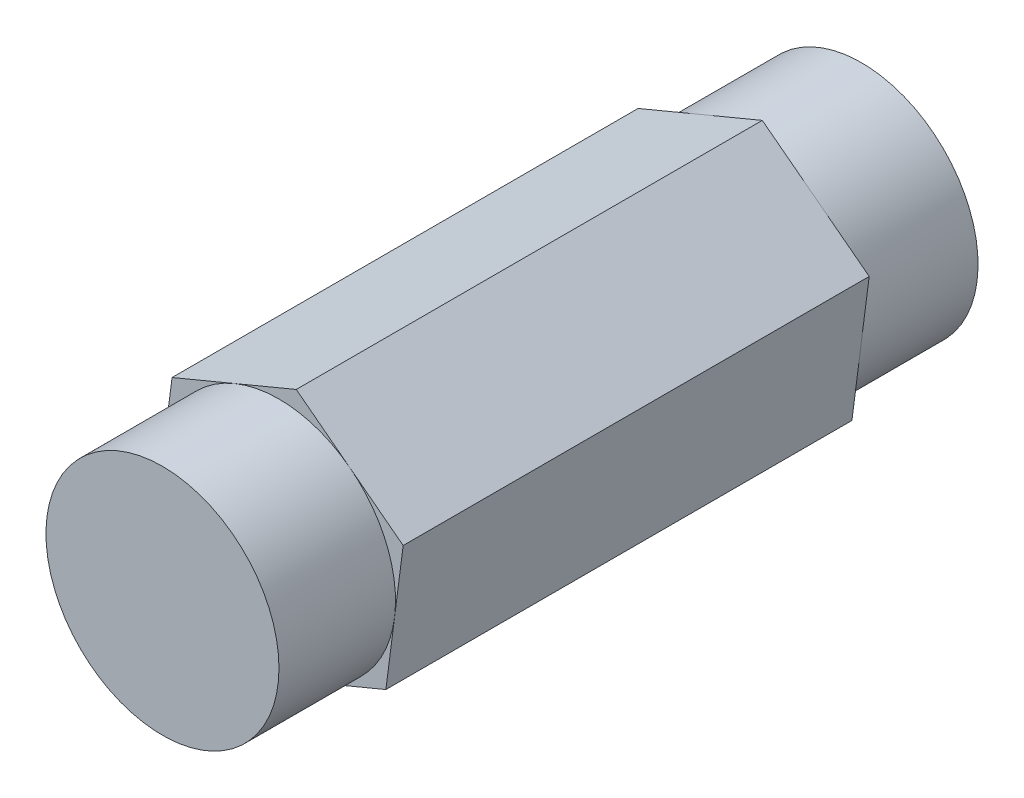
ISO-10303-21;
HEADER;
FILE_DESCRIPTION(('STEP AP214'),'2;1');
FILE_NAME('part.step','',(''),(''),'','','');
FILE_SCHEMA(('AUTOMOTIVE_DESIGN { 1 0 10303 214 1 1 1 1 }'));
ENDSEC;
DATA;
#1=APPLICATION_CONTEXT('core data for automotive mechanical design processes');
#2=APPLICATION_PROTOCOL_DEFINITION('international standard','automotive_design',2000,#1);
#3=PRODUCT_CONTEXT('',#1,'mechanical');
#4=PRODUCT('Part','Part','',(#3));
#5=PRODUCT_RELATED_PRODUCT_CATEGORY('part','',(#4));
#6=PRODUCT_DEFINITION_FORMATION('','',#4);
#7=PRODUCT_DEFINITION_CONTEXT('part definition',#1,'design');
#8=PRODUCT_DEFINITION('design','',#6,#7);
#9=PRODUCT_DEFINITION_SHAPE('','',#8);
#10=(LENGTH_UNIT() NAMED_UNIT(*) SI_UNIT(.MILLI.,.METRE.));
#11=(NAMED_UNIT(*) PLANE_ANGLE_UNIT() SI_UNIT($,.RADIAN.));
#12=(NAMED_UNIT(*) SI_UNIT($,.STERADIAN.) SOLID_ANGLE_UNIT());
#13=UNCERTAINTY_MEASURE_WITH_UNIT(LENGTH_MEASURE(1.E-05),#10,'distance_accuracy_value','');
#14=(GEOMETRIC_REPRESENTATION_CONTEXT(3) GLOBAL_UNCERTAINTY_ASSIGNED_CONTEXT((#13)) GLOBAL_UNIT_ASSIGNED_CONTEXT((#10,
#11,#12)) REPRESENTATION_CONTEXT('',''));
#15=CARTESIAN_POINT('',(0.,0.,0.));
#16=DIRECTION('',(0.,0.,1.));
#17=DIRECTION('',(1.,0.,0.));
#18=AXIS2_PLACEMENT_3D('',#15,#16,#17);
#19=CARTESIAN_POINT('',(0.,0.,20.));
#20=DIRECTION('',(0.,0.,1.));
#21=DIRECTION('',(1.,0.,0.));
#22=AXIS2_PLACEMENT_3D('',#19,#20,#21);
#23=PLANE('',#22);
#24=CARTESIAN_POINT('',(0.,0.,20.));
#25=DIRECTION('',(0.,0.,1.));
#26=DIRECTION('',(1.,0.,0.));
#27=AXIS2_PLACEMENT_3D('',#24,#25,#26);
#28=CIRCLE('',#27,4.99999999999999);
#29=CARTESIAN_POINT('',(3.03550186362045,3.97312577650854,20.));
#30=VERTEX_POINT('',#29);
#31=CARTESIAN_POINT('',(-1.92307692307694,4.61538461538459,20.));
#32=VERTEX_POINT('',#31);
#33=EDGE_CURVE('E46',#30,#32,#28,.T.);
#34=ORIENTED_EDGE('',*,*,#33,.F.);
#35=DIRECTION('',(-0.794625155301711,0.607100372724092,0.));
#36=VECTOR('',#35,1.);
#37=CARTESIAN_POINT('',(5.3293871002119,2.22057795842166,20.));
#38=LINE('',#37,#36);
#39=CARTESIAN_POINT('',(0.741616627029006,5.72567359459542,20.));
#40=VERTEX_POINT('',#39);
#41=EDGE_CURVE('E139',#30,#40,#38,.T.);
#42=ORIENTED_EDGE('',*,*,#41,.T.);
#43=DIRECTION('',(-0.923076923076921,-0.384615384615389,0.));
#44=VECTOR('',#43,1.);
#45=CARTESIAN_POINT('',(0.741616627029006,5.72567359459542,20.));
#46=LINE('',#45,#44);
#47=EDGE_CURVE('E152',#40,#32,#46,.T.);
#48=ORIENTED_EDGE('',*,*,#47,.T.);
#49=EDGE_LOOP('',(#34,#42,#48));
#50=FACE_BOUND('',#49,.T.);
#51=ADVANCED_FACE('F35',(#50),#23,.T.);
#52=CARTESIAN_POINT('',(-4.95857878669739,0.642258838876046,20.));
#53=VERTEX_POINT('',#52);
#54=EDGE_CURVE('E11',#32,#53,#28,.T.);
#55=ORIENTED_EDGE('',*,*,#54,.F.);
#56=CARTESIAN_POINT('',(-4.58777047318289,3.50509563617377,20.));
#57=VERTEX_POINT('',#56);
#58=EDGE_CURVE('E138',#32,#57,#46,.T.);
#59=ORIENTED_EDGE('',*,*,#58,.T.);
#60=DIRECTION('',(-0.12845176777521,-0.991715757339482,0.));
#61=VECTOR('',#60,1.);
#62=CARTESIAN_POINT('',(-4.58777047318289,3.50509563617377,20.));
#63=LINE('',#62,#61);
#64=EDGE_CURVE('E172',#57,#53,#63,.T.);
#65=ORIENTED_EDGE('',*,*,#64,.T.);
#66=EDGE_LOOP('',(#55,#59,#65));
#67=FACE_BOUND('',#66,.T.);
#68=ADVANCED_FACE('F254',(#67),#23,.T.);
#69=CARTESIAN_POINT('',(-3.03550186362045,-3.97312577650854,20.));
#70=VERTEX_POINT('',#69);
#71=EDGE_CURVE('E44',#53,#70,#28,.T.);
#72=ORIENTED_EDGE('',*,*,#71,.F.);
#73=CARTESIAN_POINT('',(-5.32938710021189,-2.22057795842167,20.));
#74=VERTEX_POINT('',#73);
#75=EDGE_CURVE('E171',#53,#74,#63,.T.);
#76=ORIENTED_EDGE('',*,*,#75,.T.);
#77=DIRECTION('',(0.794625155301711,-0.607100372724093,0.));
#78=VECTOR('',#77,1.);
#79=CARTESIAN_POINT('',(-5.32938710021189,-2.22057795842167,20.));
#80=LINE('',#79,#78);
#81=EDGE_CURVE('E176',#74,#70,#80,.T.);
#82=ORIENTED_EDGE('',*,*,#81,.T.);
#83=EDGE_LOOP('',(#72,#76,#82));
#84=FACE_BOUND('',#83,.T.);
#85=ADVANCED_FACE('F257',(#84),#23,.T.);
#86=CARTESIAN_POINT('',(1.92307692307695,-4.6153846153846,20.));
#87=VERTEX_POINT('',#86);
#88=EDGE_CURVE('E61',#70,#87,#28,.T.);
#89=ORIENTED_EDGE('',*,*,#88,.F.);
#90=CARTESIAN_POINT('',(-0.741616627028999,-5.72567359459543,20.));
#91=VERTEX_POINT('',#90);
#92=EDGE_CURVE('E175',#70,#91,#80,.T.);
#93=ORIENTED_EDGE('',*,*,#92,.T.);
#94=DIRECTION('',(0.923076923076921,0.38461538461539,0.));
#95=VECTOR('',#94,1.);
#96=CARTESIAN_POINT('',(-0.741616627028999,-5.72567359459543,20.));
#97=LINE('',#96,#95);
#98=EDGE_CURVE('E180',#91,#87,#97,.T.);
#99=ORIENTED_EDGE('',*,*,#98,.T.);
#100=EDGE_LOOP('',(#89,#93,#99));
#101=FACE_BOUND('',#100,.T.);
#102=ADVANCED_FACE('F259',(#101),#23,.T.);
#103=CARTESIAN_POINT('',(4.9585787866974,-0.642258838876049,20.));
#104=VERTEX_POINT('',#103);
#105=EDGE_CURVE('E53',#87,#104,#28,.T.);
#106=ORIENTED_EDGE('',*,*,#105,.F.);
#107=CARTESIAN_POINT('',(4.5877704731829,-3.50509563617377,20.));
#108=VERTEX_POINT('',#107);
#109=EDGE_CURVE('E179',#87,#108,#97,.T.);
#110=ORIENTED_EDGE('',*,*,#109,.T.);
#111=DIRECTION('',(0.12845176777521,0.991715757339482,0.));
#112=VECTOR('',#111,1.);
#113=CARTESIAN_POINT('',(4.5877704731829,-3.50509563617377,20.));
#114=LINE('',#113,#112);
#115=EDGE_CURVE('E150',#108,#104,#114,.T.);
#116=ORIENTED_EDGE('',*,*,#115,.T.);
#117=EDGE_LOOP('',(#106,#110,#116));
#118=FACE_BOUND('',#117,.T.);
#119=ADVANCED_FACE('F265',(#118),#23,.T.);
#120=CARTESIAN_POINT('',(0.,0.,0.));
#121=DIRECTION('',(0.,0.,1.));
#122=DIRECTION('',(1.,0.,0.));
#123=AXIS2_PLACEMENT_3D('',#120,#121,#122);
#124=PLANE('',#123);
#125=CARTESIAN_POINT('',(0.,0.,0.));
#126=DIRECTION('',(0.,0.,-1.));
#127=DIRECTION('',(-1.,0.,0.));
#128=AXIS2_PLACEMENT_3D('',#125,#126,#127);
#129=CIRCLE('',#128,4.99999999999998);
#130=CARTESIAN_POINT('',(-4.9585787866974,0.642258838876047,0.));
#131=VERTEX_POINT('',#130);
#132=CARTESIAN_POINT('',(-1.92307692307694,4.61538461538459,0.));
#133=VERTEX_POINT('',#132);
#134=EDGE_CURVE('E160',#131,#133,#129,.T.);
#135=ORIENTED_EDGE('',*,*,#134,.F.);
#136=DIRECTION('',(-0.12845176777521,-0.991715757339482,0.));
#137=VECTOR('',#136,1.);
#138=CARTESIAN_POINT('',(-4.58777047318289,3.50509563617377,0.));
#139=LINE('',#138,#137);
#140=CARTESIAN_POINT('',(-4.58777047318289,3.50509563617377,0.));
#141=VERTEX_POINT('',#140);
#142=EDGE_CURVE('E194',#141,#131,#139,.T.);
#143=ORIENTED_EDGE('',*,*,#142,.F.);
#144=DIRECTION('',(-0.923076923076921,-0.384615384615389,0.));
#145=VECTOR('',#144,1.);
#146=CARTESIAN_POINT('',(0.741616627029006,5.72567359459542,0.));
#147=LINE('',#146,#145);
#148=EDGE_CURVE('E189',#133,#141,#147,.T.);
#149=ORIENTED_EDGE('',*,*,#148,.F.);
#150=EDGE_LOOP('',(#135,#143,#149));
#151=FACE_BOUND('',#150,.T.);
#152=ADVANCED_FACE('F237',(#151),#124,.F.);
#153=CARTESIAN_POINT('',(3.03550186362045,3.97312577650854,0.));
#154=VERTEX_POINT('',#153);
#155=EDGE_CURVE('E156',#133,#154,#129,.T.);
#156=ORIENTED_EDGE('',*,*,#155,.F.);
#157=CARTESIAN_POINT('',(0.741616627029006,5.72567359459542,0.));
#158=VERTEX_POINT('',#157);
#159=EDGE_CURVE('E190',#158,#133,#147,.T.);
#160=ORIENTED_EDGE('',*,*,#159,.F.);
#161=DIRECTION('',(-0.794625155301711,0.607100372724092,0.));
#162=VECTOR('',#161,1.);
#163=CARTESIAN_POINT('',(5.3293871002119,2.22057795842166,0.));
#164=LINE('',#163,#162);
#165=EDGE_CURVE('E186',#154,#158,#164,.T.);
#166=ORIENTED_EDGE('',*,*,#165,.F.);
#167=EDGE_LOOP('',(#156,#160,#166));
#168=FACE_BOUND('',#167,.T.);
#169=ADVANCED_FACE('F230',(#168),#124,.F.);
#170=CARTESIAN_POINT('',(4.9585787866974,-0.642258838876049,0.));
#171=VERTEX_POINT('',#170);
#172=EDGE_CURVE('E158',#154,#171,#129,.T.);
#173=ORIENTED_EDGE('',*,*,#172,.F.);
#174=CARTESIAN_POINT('',(5.3293871002119,2.22057795842166,0.));
#175=VERTEX_POINT('',#174);
#176=EDGE_CURVE('E187',#175,#154,#164,.T.);
#177=ORIENTED_EDGE('',*,*,#176,.F.);
#178=DIRECTION('',(0.12845176777521,0.991715757339482,0.));
#179=VECTOR('',#178,1.);
#180=CARTESIAN_POINT('',(4.5877704731829,-3.50509563617377,0.));
#181=LINE('',#180,#179);
#182=EDGE_CURVE('E165',#171,#175,#181,.T.);
#183=ORIENTED_EDGE('',*,*,#182,.F.);
#184=EDGE_LOOP('',(#173,#177,#183));
#185=FACE_BOUND('',#184,.T.);
#186=ADVANCED_FACE('F228',(#185),#124,.F.);
#187=CARTESIAN_POINT('',(1.92307692307695,-4.6153846153846,0.));
#188=VERTEX_POINT('',#187);
#189=EDGE_CURVE('E220',#171,#188,#129,.T.);
#190=ORIENTED_EDGE('',*,*,#189,.F.);
#191=CARTESIAN_POINT('',(4.5877704731829,-3.50509563617377,0.));
#192=VERTEX_POINT('',#191);
#193=EDGE_CURVE('E183',#192,#171,#181,.T.);
#194=ORIENTED_EDGE('',*,*,#193,.F.);
#195=DIRECTION('',(0.923076923076921,0.38461538461539,0.));
#196=VECTOR('',#195,1.);
#197=CARTESIAN_POINT('',(-0.741616627028999,-5.72567359459543,0.));
#198=LINE('',#197,#196);
#199=EDGE_CURVE('E200',#188,#192,#198,.T.);
#200=ORIENTED_EDGE('',*,*,#199,.F.);
#201=EDGE_LOOP('',(#190,#194,#200));
#202=FACE_BOUND('',#201,.T.);
#203=ADVANCED_FACE('F301',(#202),#124,.F.);
#204=CARTESIAN_POINT('',(-3.03550186362045,-3.97312577650854,0.));
#205=VERTEX_POINT('',#204);
#206=EDGE_CURVE('E217',#188,#205,#129,.T.);
#207=ORIENTED_EDGE('',*,*,#206,.F.);
#208=CARTESIAN_POINT('',(-0.741616627028999,-5.72567359459543,0.));
#209=VERTEX_POINT('',#208);
#210=EDGE_CURVE('E201',#209,#188,#198,.T.);
#211=ORIENTED_EDGE('',*,*,#210,.F.);
#212=DIRECTION('',(0.794625155301711,-0.607100372724093,0.));
#213=VECTOR('',#212,1.);
#214=CARTESIAN_POINT('',(-5.32938710021189,-2.22057795842167,0.));
#215=LINE('',#214,#213);
#216=EDGE_CURVE('E196',#205,#209,#215,.T.);
#217=ORIENTED_EDGE('',*,*,#216,.F.);
#218=EDGE_LOOP('',(#207,#211,#217));
#219=FACE_BOUND('',#218,.T.);
#220=ADVANCED_FACE('F277',(#219),#124,.F.);
#221=CARTESIAN_POINT('',(4.5877704731829,-3.50509563617377,20.));
#222=DIRECTION('',(-0.991715757339483,0.12845176777521,0.));
#223=DIRECTION('',(-0.12845176777521,-0.991715757339483,0.));
#224=AXIS2_PLACEMENT_3D('',#221,#222,#223);
#225=PLANE('',#224);
#226=ORIENTED_EDGE('',*,*,#193,.T.);
#227=ORIENTED_EDGE('',*,*,#182,.T.);
#228=DIRECTION('',(0.,0.,-1.));
#229=VECTOR('',#228,1.);
#230=CARTESIAN_POINT('',(5.3293871002119,2.22057795842166,20.));
#231=LINE('',#230,#229);
#232=CARTESIAN_POINT('',(5.3293871002119,2.22057795842166,20.));
#233=VERTEX_POINT('',#232);
#234=EDGE_CURVE('E39',#233,#175,#231,.T.);
#235=ORIENTED_EDGE('',*,*,#234,.F.);
#236=EDGE_CURVE('E134',#104,#233,#114,.T.);
#237=ORIENTED_EDGE('',*,*,#236,.F.);
#238=ORIENTED_EDGE('',*,*,#115,.F.);
#239=DIRECTION('',(0.,0.,-1.));
#240=VECTOR('',#239,1.);
#241=CARTESIAN_POINT('',(4.5877704731829,-3.50509563617377,20.));
#242=LINE('',#241,#240);
#243=EDGE_CURVE('E182',#108,#192,#242,.T.);
#244=ORIENTED_EDGE('',*,*,#243,.T.);
#245=EDGE_LOOP('',(#226,#227,#235,#237,#238,#244));
#246=FACE_BOUND('',#245,.T.);
#247=ADVANCED_FACE('F37',(#246),#225,.F.);
#248=CARTESIAN_POINT('',(5.3293871002119,2.22057795842166,20.));
#249=DIRECTION('',(-0.607100372724092,-0.794625155301711,0.));
#250=DIRECTION('',(0.794625155301711,-0.607100372724092,0.));
#251=AXIS2_PLACEMENT_3D('',#248,#249,#250);
#252=PLANE('',#251);
#253=ORIENTED_EDGE('',*,*,#176,.T.);
#254=ORIENTED_EDGE('',*,*,#165,.T.);
#255=DIRECTION('',(0.,0.,-1.));
#256=VECTOR('',#255,1.);
#257=CARTESIAN_POINT('',(0.741616627029006,5.72567359459542,20.));
#258=LINE('',#257,#256);
#259=EDGE_CURVE('E146',#40,#158,#258,.T.);
#260=ORIENTED_EDGE('',*,*,#259,.F.);
#261=ORIENTED_EDGE('',*,*,#41,.F.);
#262=EDGE_CURVE('E128',#233,#30,#38,.T.);
#263=ORIENTED_EDGE('',*,*,#262,.F.);
#264=ORIENTED_EDGE('',*,*,#234,.T.);
#265=EDGE_LOOP('',(#253,#254,#260,#261,#263,#264));
#266=FACE_BOUND('',#265,.T.);
#267=ADVANCED_FACE('F144',(#266),#252,.F.);
#268=CARTESIAN_POINT('',(0.741616627029006,5.72567359459542,20.));
#269=DIRECTION('',(0.384615384615389,-0.923076923076921,0.));
#270=DIRECTION('',(0.923076923076921,0.384615384615389,0.));
#271=AXIS2_PLACEMENT_3D('',#268,#269,#270);
#272=PLANE('',#271);
#273=ORIENTED_EDGE('',*,*,#159,.T.);
#274=ORIENTED_EDGE('',*,*,#148,.T.);
#275=DIRECTION('',(0.,0.,-1.));
#276=VECTOR('',#275,1.);
#277=CARTESIAN_POINT('',(-4.58777047318289,3.50509563617377,20.));
#278=LINE('',#277,#276);
#279=EDGE_CURVE('E212',#57,#141,#278,.T.);
#280=ORIENTED_EDGE('',*,*,#279,.F.);
#281=ORIENTED_EDGE('',*,*,#58,.F.);
#282=ORIENTED_EDGE('',*,*,#47,.F.);
#283=ORIENTED_EDGE('',*,*,#259,.T.);
#284=EDGE_LOOP('',(#273,#274,#280,#281,#282,#283));
#285=FACE_BOUND('',#284,.T.);
#286=ADVANCED_FACE('F232',(#285),#272,.F.);
#287=CARTESIAN_POINT('',(-4.58777047318289,3.50509563617377,20.));
#288=DIRECTION('',(0.991715757339483,-0.12845176777521,0.));
#289=DIRECTION('',(0.12845176777521,0.991715757339483,0.));
#290=AXIS2_PLACEMENT_3D('',#287,#288,#289);
#291=PLANE('',#290);
#292=ORIENTED_EDGE('',*,*,#142,.T.);
#293=CARTESIAN_POINT('',(-5.32938710021189,-2.22057795842167,0.));
#294=VERTEX_POINT('',#293);
#295=EDGE_CURVE('E193',#131,#294,#139,.T.);
#296=ORIENTED_EDGE('',*,*,#295,.T.);
#297=DIRECTION('',(0.,0.,-1.));
#298=VECTOR('',#297,1.);
#299=CARTESIAN_POINT('',(-5.32938710021189,-2.22057795842167,20.));
#300=LINE('',#299,#298);
#301=EDGE_CURVE('E209',#74,#294,#300,.T.);
#302=ORIENTED_EDGE('',*,*,#301,.F.);
#303=ORIENTED_EDGE('',*,*,#75,.F.);
#304=ORIENTED_EDGE('',*,*,#64,.F.);
#305=ORIENTED_EDGE('',*,*,#279,.T.);
#306=EDGE_LOOP('',(#292,#296,#302,#303,#304,#305));
#307=FACE_BOUND('',#306,.T.);
#308=ADVANCED_FACE('F240',(#307),#291,.F.);
#309=CARTESIAN_POINT('',(-5.32938710021189,-2.22057795842167,20.));
#310=DIRECTION('',(0.607100372724093,0.794625155301711,0.));
#311=DIRECTION('',(-0.794625155301711,0.607100372724093,0.));
#312=AXIS2_PLACEMENT_3D('',#309,#310,#311);
#313=PLANE('',#312);
#314=EDGE_CURVE('E197',#294,#205,#215,.T.);
#315=ORIENTED_EDGE('',*,*,#314,.T.);
#316=ORIENTED_EDGE('',*,*,#216,.T.);
#317=DIRECTION('',(0.,0.,-1.));
#318=VECTOR('',#317,1.);
#319=CARTESIAN_POINT('',(-0.741616627028999,-5.72567359459543,20.));
#320=LINE('',#319,#318);
#321=EDGE_CURVE('E206',#91,#209,#320,.T.);
#322=ORIENTED_EDGE('',*,*,#321,.F.);
#323=ORIENTED_EDGE('',*,*,#92,.F.);
#324=ORIENTED_EDGE('',*,*,#81,.F.);
#325=ORIENTED_EDGE('',*,*,#301,.T.);
#326=EDGE_LOOP('',(#315,#316,#322,#323,#324,#325));
#327=FACE_BOUND('',#326,.T.);
#328=ADVANCED_FACE('F248',(#327),#313,.F.);
#329=CARTESIAN_POINT('',(-0.741616627028999,-5.72567359459543,20.));
#330=DIRECTION('',(-0.38461538461539,0.923076923076921,0.));
#331=DIRECTION('',(-0.923076923076921,-0.38461538461539,0.));
#332=AXIS2_PLACEMENT_3D('',#329,#330,#331);
#333=PLANE('',#332);
#334=ORIENTED_EDGE('',*,*,#210,.T.);
#335=ORIENTED_EDGE('',*,*,#199,.T.);
#336=ORIENTED_EDGE('',*,*,#243,.F.);
#337=ORIENTED_EDGE('',*,*,#109,.F.);
#338=ORIENTED_EDGE('',*,*,#98,.F.);
#339=ORIENTED_EDGE('',*,*,#321,.T.);
#340=EDGE_LOOP('',(#334,#335,#336,#337,#338,#339));
#341=FACE_BOUND('',#340,.T.);
#342=ADVANCED_FACE('F272',(#341),#333,.F.);
#343=EDGE_CURVE('E132',#104,#30,#28,.T.);
#344=ORIENTED_EDGE('',*,*,#343,.F.);
#345=ORIENTED_EDGE('',*,*,#236,.T.);
#346=ORIENTED_EDGE('',*,*,#262,.T.);
#347=EDGE_LOOP('',(#344,#345,#346));
#348=FACE_BOUND('',#347,.T.);
#349=ADVANCED_FACE('F130',(#348),#23,.T.);
#350=EDGE_CURVE('E168',#205,#131,#129,.T.);
#351=ORIENTED_EDGE('',*,*,#350,.F.);
#352=ORIENTED_EDGE('',*,*,#314,.F.);
#353=ORIENTED_EDGE('',*,*,#295,.F.);
#354=EDGE_LOOP('',(#351,#352,#353));
#355=FACE_BOUND('',#354,.T.);
#356=ADVANCED_FACE('F245',(#355),#124,.F.);
#357=CARTESIAN_POINT('',(0.,0.,-5.));
#358=DIRECTION('',(0.,0.,1.));
#359=DIRECTION('',(1.,0.,0.));
#360=AXIS2_PLACEMENT_3D('',#357,#358,#359);
#361=CYLINDRICAL_SURFACE('',#360,4.99999999999998);
#362=CARTESIAN_POINT('',(0.,0.,-5.));
#363=DIRECTION('',(0.,0.,-1.));
#364=DIRECTION('',(-1.,0.,0.));
#365=AXIS2_PLACEMENT_3D('',#362,#363,#364);
#366=CIRCLE('',#365,4.99999999999998);
#367=CARTESIAN_POINT('',(-4.99999999999998,0.,-5.));
#368=VERTEX_POINT('',#367);
#369=EDGE_CURVE('E163',#368,#368,#366,.T.);
#370=ORIENTED_EDGE('',*,*,#369,.F.);
#371=EDGE_LOOP('',(#370));
#372=FACE_BOUND('',#371,.T.);
#373=ORIENTED_EDGE('',*,*,#134,.T.);
#374=ORIENTED_EDGE('',*,*,#155,.T.);
#375=ORIENTED_EDGE('',*,*,#172,.T.);
#376=ORIENTED_EDGE('',*,*,#189,.T.);
#377=ORIENTED_EDGE('',*,*,#206,.T.);
#378=ORIENTED_EDGE('',*,*,#350,.T.);
#379=EDGE_LOOP('',(#373,#374,#375,#376,#377,#378));
#380=FACE_BOUND('',#379,.T.);
#381=ADVANCED_FACE('F223',(#372,#380),#361,.T.);
#382=CARTESIAN_POINT('',(0.,0.,-5.));
#383=DIRECTION('',(0.,0.,-1.));
#384=DIRECTION('',(-1.,0.,0.));
#385=AXIS2_PLACEMENT_3D('',#382,#383,#384);
#386=PLANE('',#385);
#387=ORIENTED_EDGE('',*,*,#369,.T.);
#388=EDGE_LOOP('',(#387));
#389=FACE_BOUND('',#388,.T.);
#390=ADVANCED_FACE('F334',(#389),#386,.T.);
#391=CARTESIAN_POINT('',(0.,0.,25.));
#392=DIRECTION('',(0.,0.,-1.));
#393=DIRECTION('',(-1.,0.,0.));
#394=AXIS2_PLACEMENT_3D('',#391,#392,#393);
#395=CYLINDRICAL_SURFACE('',#394,4.99999999999999);
#396=CARTESIAN_POINT('',(0.,0.,25.));
#397=DIRECTION('',(0.,0.,1.));
#398=DIRECTION('',(1.,0.,0.));
#399=AXIS2_PLACEMENT_3D('',#396,#397,#398);
#400=CIRCLE('',#399,4.99999999999999);
#401=CARTESIAN_POINT('',(4.99999999999999,0.,25.));
#402=VERTEX_POINT('',#401);
#403=EDGE_CURVE('E154',#402,#402,#400,.T.);
#404=ORIENTED_EDGE('',*,*,#403,.F.);
#405=EDGE_LOOP('',(#404));
#406=FACE_BOUND('',#405,.T.);
#407=ORIENTED_EDGE('',*,*,#33,.T.);
#408=ORIENTED_EDGE('',*,*,#54,.T.);
#409=ORIENTED_EDGE('',*,*,#71,.T.);
#410=ORIENTED_EDGE('',*,*,#88,.T.);
#411=ORIENTED_EDGE('',*,*,#105,.T.);
#412=ORIENTED_EDGE('',*,*,#343,.T.);
#413=EDGE_LOOP('',(#407,#408,#409,#410,#411,#412));
#414=FACE_BOUND('',#413,.T.);
#415=ADVANCED_FACE('F155',(#406,#414),#395,.T.);
#416=CARTESIAN_POINT('',(0.,0.,25.));
#417=DIRECTION('',(0.,0.,1.));
#418=DIRECTION('',(1.,0.,0.));
#419=AXIS2_PLACEMENT_3D('',#416,#417,#418);
#420=PLANE('',#419);
#421=ORIENTED_EDGE('',*,*,#403,.T.);
#422=EDGE_LOOP('',(#421));
#423=FACE_BOUND('',#422,.T.);
#424=ADVANCED_FACE('F373',(#423),#420,.T.);
#425=CLOSED_SHELL('',(#51,#68,#85,#102,#119,#152,#169,#186,#203,#220,#247,#267,#286,#308,#328,
#342,#349,#356,#381,#390,#415,#424));
#426=MANIFOLD_SOLID_BREP('B2',#425);
#427=ADVANCED_BREP_SHAPE_REPRESENTATION('',(#18,#426),#14);
#428=SHAPE_DEFINITION_REPRESENTATION(#9,#427);
ENDSEC;
END-ISO-10303-21;
